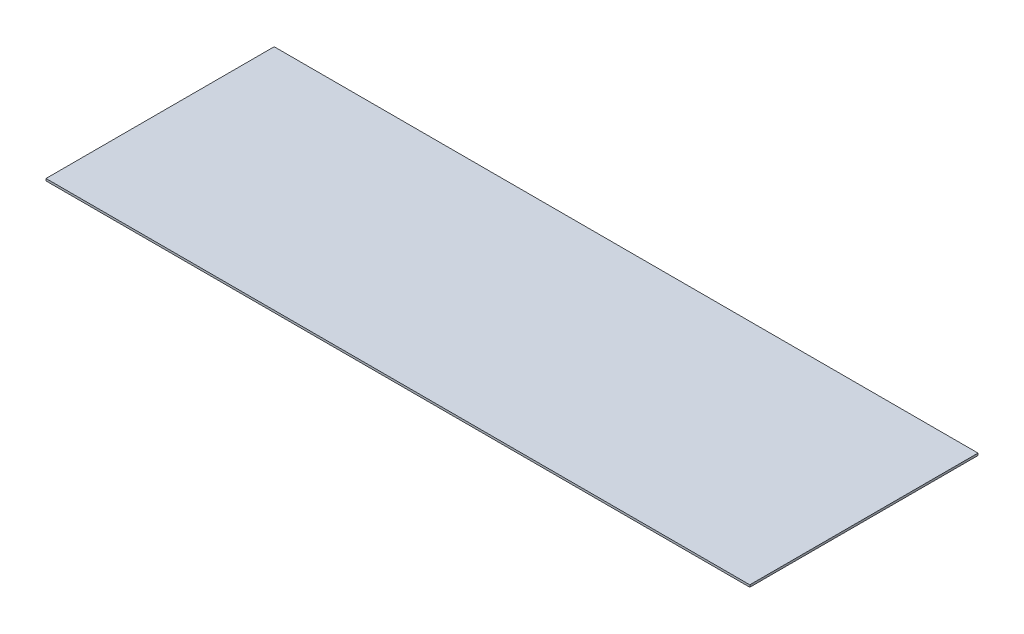
ISO-10303-21;
HEADER;
FILE_DESCRIPTION(('STEP AP214'),'2;1');
FILE_NAME('part.step','',(''),(''),'','','');
FILE_SCHEMA(('AUTOMOTIVE_DESIGN { 1 0 10303 214 1 1 1 1 }'));
ENDSEC;
DATA;
#1=APPLICATION_CONTEXT('core data for automotive mechanical design processes');
#2=APPLICATION_PROTOCOL_DEFINITION('international standard','automotive_design',2000,#1);
#3=PRODUCT_CONTEXT('',#1,'mechanical');
#4=PRODUCT('Part','Part','',(#3));
#5=PRODUCT_RELATED_PRODUCT_CATEGORY('part','',(#4));
#6=PRODUCT_DEFINITION_FORMATION('','',#4);
#7=PRODUCT_DEFINITION_CONTEXT('part definition',#1,'design');
#8=PRODUCT_DEFINITION('design','',#6,#7);
#9=PRODUCT_DEFINITION_SHAPE('','',#8);
#10=(LENGTH_UNIT() NAMED_UNIT(*) SI_UNIT(.MILLI.,.METRE.));
#11=(NAMED_UNIT(*) PLANE_ANGLE_UNIT() SI_UNIT($,.RADIAN.));
#12=(NAMED_UNIT(*) SI_UNIT($,.STERADIAN.) SOLID_ANGLE_UNIT());
#13=UNCERTAINTY_MEASURE_WITH_UNIT(LENGTH_MEASURE(1.E-05),#10,'distance_accuracy_value','');
#14=(GEOMETRIC_REPRESENTATION_CONTEXT(3) GLOBAL_UNCERTAINTY_ASSIGNED_CONTEXT((#13)) GLOBAL_UNIT_ASSIGNED_CONTEXT((#10,
#11,#12)) REPRESENTATION_CONTEXT('',''));
#15=CARTESIAN_POINT('',(0.,0.,0.));
#16=DIRECTION('',(0.,0.,1.));
#17=DIRECTION('',(1.,0.,0.));
#18=AXIS2_PLACEMENT_3D('',#15,#16,#17);
#19=CARTESIAN_POINT('',(493.5,3.,-160.));
#20=DIRECTION('',(-1.,0.,0.));
#21=DIRECTION('',(0.,0.,1.));
#22=AXIS2_PLACEMENT_3D('',#19,#20,#21);
#23=PLANE('',#22);
#24=DIRECTION('',(0.,0.,-1.));
#25=VECTOR('',#24,1.);
#26=CARTESIAN_POINT('',(493.5,0.,-160.));
#27=LINE('',#26,#25);
#28=CARTESIAN_POINT('',(493.5,0.,160.));
#29=VERTEX_POINT('',#28);
#30=CARTESIAN_POINT('',(493.5,0.,-160.));
#31=VERTEX_POINT('',#30);
#32=EDGE_CURVE('E98',#29,#31,#27,.T.);
#33=ORIENTED_EDGE('',*,*,#32,.T.);
#34=DIRECTION('',(0.,-1.,0.));
#35=VECTOR('',#34,1.);
#36=CARTESIAN_POINT('',(493.5,3.,-160.));
#37=LINE('',#36,#35);
#38=CARTESIAN_POINT('',(493.5,3.,-160.));
#39=VERTEX_POINT('',#38);
#40=EDGE_CURVE('E11',#39,#31,#37,.T.);
#41=ORIENTED_EDGE('',*,*,#40,.F.);
#42=DIRECTION('',(0.,0.,-1.));
#43=VECTOR('',#42,1.);
#44=CARTESIAN_POINT('',(493.5,3.,-160.));
#45=LINE('',#44,#43);
#46=CARTESIAN_POINT('',(493.5,3.,160.));
#47=VERTEX_POINT('',#46);
#48=EDGE_CURVE('E86',#47,#39,#45,.T.);
#49=ORIENTED_EDGE('',*,*,#48,.F.);
#50=DIRECTION('',(0.,-1.,0.));
#51=VECTOR('',#50,1.);
#52=CARTESIAN_POINT('',(493.5,3.,160.));
#53=LINE('',#52,#51);
#54=EDGE_CURVE('E94',#47,#29,#53,.T.);
#55=ORIENTED_EDGE('',*,*,#54,.T.);
#56=EDGE_LOOP('',(#33,#41,#49,#55));
#57=FACE_BOUND('',#56,.T.);
#58=ADVANCED_FACE('F35',(#57),#23,.F.);
#59=CARTESIAN_POINT('',(-493.5,3.,-160.));
#60=DIRECTION('',(0.,0.,1.));
#61=DIRECTION('',(1.,0.,0.));
#62=AXIS2_PLACEMENT_3D('',#59,#60,#61);
#63=PLANE('',#62);
#64=DIRECTION('',(-1.,0.,0.));
#65=VECTOR('',#64,1.);
#66=CARTESIAN_POINT('',(-493.5,0.,-160.));
#67=LINE('',#66,#65);
#68=CARTESIAN_POINT('',(-493.5,0.,-160.));
#69=VERTEX_POINT('',#68);
#70=EDGE_CURVE('E90',#31,#69,#67,.T.);
#71=ORIENTED_EDGE('',*,*,#70,.T.);
#72=DIRECTION('',(0.,-1.,0.));
#73=VECTOR('',#72,1.);
#74=CARTESIAN_POINT('',(-493.5,3.,-160.));
#75=LINE('',#74,#73);
#76=CARTESIAN_POINT('',(-493.5,3.,-160.));
#77=VERTEX_POINT('',#76);
#78=EDGE_CURVE('E43',#77,#69,#75,.T.);
#79=ORIENTED_EDGE('',*,*,#78,.F.);
#80=DIRECTION('',(-1.,0.,0.));
#81=VECTOR('',#80,1.);
#82=CARTESIAN_POINT('',(-493.5,3.,-160.));
#83=LINE('',#82,#81);
#84=EDGE_CURVE('E81',#39,#77,#83,.T.);
#85=ORIENTED_EDGE('',*,*,#84,.F.);
#86=ORIENTED_EDGE('',*,*,#40,.T.);
#87=EDGE_LOOP('',(#71,#79,#85,#86));
#88=FACE_BOUND('',#87,.T.);
#89=ADVANCED_FACE('F89',(#88),#63,.F.);
#90=CARTESIAN_POINT('',(-493.5,3.,-160.));
#91=DIRECTION('',(1.,0.,0.));
#92=DIRECTION('',(0.,0.,-1.));
#93=AXIS2_PLACEMENT_3D('',#90,#91,#92);
#94=PLANE('',#93);
#95=DIRECTION('',(0.,0.,1.));
#96=VECTOR('',#95,1.);
#97=CARTESIAN_POINT('',(-493.5,0.,-160.));
#98=LINE('',#97,#96);
#99=CARTESIAN_POINT('',(-493.5,0.,160.));
#100=VERTEX_POINT('',#99);
#101=EDGE_CURVE('E68',#69,#100,#98,.T.);
#102=ORIENTED_EDGE('',*,*,#101,.T.);
#103=DIRECTION('',(0.,-1.,0.));
#104=VECTOR('',#103,1.);
#105=CARTESIAN_POINT('',(-493.5,3.,160.));
#106=LINE('',#105,#104);
#107=CARTESIAN_POINT('',(-493.5,3.,160.));
#108=VERTEX_POINT('',#107);
#109=EDGE_CURVE('E91',#108,#100,#106,.T.);
#110=ORIENTED_EDGE('',*,*,#109,.F.);
#111=DIRECTION('',(0.,0.,1.));
#112=VECTOR('',#111,1.);
#113=CARTESIAN_POINT('',(-493.5,3.,-160.));
#114=LINE('',#113,#112);
#115=EDGE_CURVE('E84',#77,#108,#114,.T.);
#116=ORIENTED_EDGE('',*,*,#115,.F.);
#117=ORIENTED_EDGE('',*,*,#78,.T.);
#118=EDGE_LOOP('',(#102,#110,#116,#117));
#119=FACE_BOUND('',#118,.T.);
#120=ADVANCED_FACE('F92',(#119),#94,.F.);
#121=CARTESIAN_POINT('',(-493.5,3.,160.));
#122=DIRECTION('',(0.,0.,-1.));
#123=DIRECTION('',(-1.,0.,0.));
#124=AXIS2_PLACEMENT_3D('',#121,#122,#123);
#125=PLANE('',#124);
#126=DIRECTION('',(1.,0.,0.));
#127=VECTOR('',#126,1.);
#128=CARTESIAN_POINT('',(-493.5,0.,160.));
#129=LINE('',#128,#127);
#130=EDGE_CURVE('E74',#100,#29,#129,.T.);
#131=ORIENTED_EDGE('',*,*,#130,.T.);
#132=ORIENTED_EDGE('',*,*,#54,.F.);
#133=DIRECTION('',(1.,0.,0.));
#134=VECTOR('',#133,1.);
#135=CARTESIAN_POINT('',(-493.5,3.,160.));
#136=LINE('',#135,#134);
#137=EDGE_CURVE('E51',#108,#47,#136,.T.);
#138=ORIENTED_EDGE('',*,*,#137,.F.);
#139=ORIENTED_EDGE('',*,*,#109,.T.);
#140=EDGE_LOOP('',(#131,#132,#138,#139));
#141=FACE_BOUND('',#140,.T.);
#142=ADVANCED_FACE('F105',(#141),#125,.F.);
#143=CARTESIAN_POINT('',(0.,3.,0.));
#144=DIRECTION('',(0.,1.,0.));
#145=DIRECTION('',(0.,0.,1.));
#146=AXIS2_PLACEMENT_3D('',#143,#144,#145);
#147=PLANE('',#146);
#148=ORIENTED_EDGE('',*,*,#48,.T.);
#149=ORIENTED_EDGE('',*,*,#84,.T.);
#150=ORIENTED_EDGE('',*,*,#115,.T.);
#151=ORIENTED_EDGE('',*,*,#137,.T.);
#152=EDGE_LOOP('',(#148,#149,#150,#151));
#153=FACE_BOUND('',#152,.T.);
#154=ADVANCED_FACE('F82',(#153),#147,.T.);
#155=CARTESIAN_POINT('',(0.,0.,0.));
#156=DIRECTION('',(0.,1.,0.));
#157=DIRECTION('',(0.,0.,1.));
#158=AXIS2_PLACEMENT_3D('',#155,#156,#157);
#159=PLANE('',#158);
#160=ORIENTED_EDGE('',*,*,#32,.F.);
#161=ORIENTED_EDGE('',*,*,#130,.F.);
#162=ORIENTED_EDGE('',*,*,#101,.F.);
#163=ORIENTED_EDGE('',*,*,#70,.F.);
#164=EDGE_LOOP('',(#160,#161,#162,#163));
#165=FACE_BOUND('',#164,.T.);
#166=ADVANCED_FACE('F108',(#165),#159,.F.);
#167=CLOSED_SHELL('',(#58,#89,#120,#142,#154,#166));
#168=MANIFOLD_SOLID_BREP('B2',#167);
#169=ADVANCED_BREP_SHAPE_REPRESENTATION('',(#18,#168),#14);
#170=SHAPE_DEFINITION_REPRESENTATION(#9,#169);
ENDSEC;
END-ISO-10303-21;
